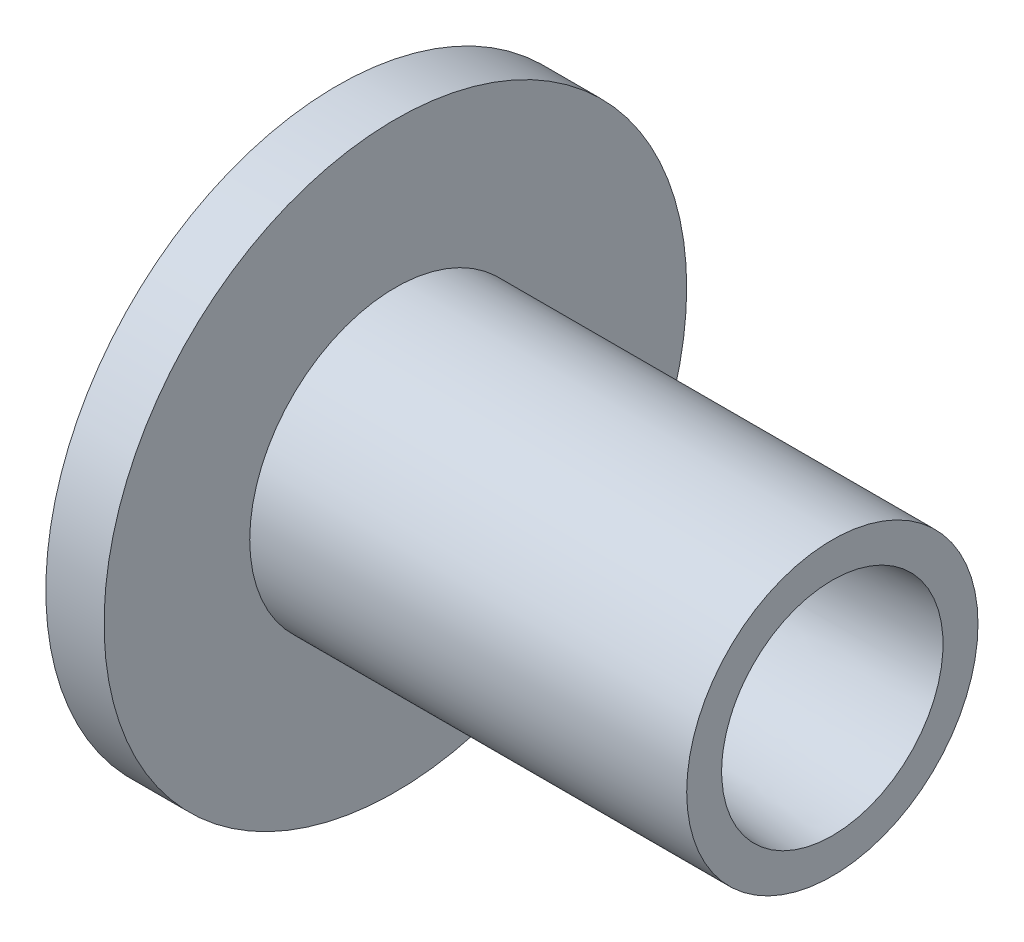
ISO-10303-21;
HEADER;
FILE_DESCRIPTION(('STEP AP214'),'2;1');
FILE_NAME('part.step','',(''),(''),'','','');
FILE_SCHEMA(('AUTOMOTIVE_DESIGN { 1 0 10303 214 1 1 1 1 }'));
ENDSEC;
DATA;
#1=APPLICATION_CONTEXT('core data for automotive mechanical design processes');
#2=APPLICATION_PROTOCOL_DEFINITION('international standard','automotive_design',2000,#1);
#3=PRODUCT_CONTEXT('',#1,'mechanical');
#4=PRODUCT('Part','Part','',(#3));
#5=PRODUCT_RELATED_PRODUCT_CATEGORY('part','',(#4));
#6=PRODUCT_DEFINITION_FORMATION('','',#4);
#7=PRODUCT_DEFINITION_CONTEXT('part definition',#1,'design');
#8=PRODUCT_DEFINITION('design','',#6,#7);
#9=PRODUCT_DEFINITION_SHAPE('','',#8);
#10=(LENGTH_UNIT() NAMED_UNIT(*) SI_UNIT(.MILLI.,.METRE.));
#11=(NAMED_UNIT(*) PLANE_ANGLE_UNIT() SI_UNIT($,.RADIAN.));
#12=(NAMED_UNIT(*) SI_UNIT($,.STERADIAN.) SOLID_ANGLE_UNIT());
#13=UNCERTAINTY_MEASURE_WITH_UNIT(LENGTH_MEASURE(1.E-05),#10,'distance_accuracy_value','');
#14=(GEOMETRIC_REPRESENTATION_CONTEXT(3) GLOBAL_UNCERTAINTY_ASSIGNED_CONTEXT((#13)) GLOBAL_UNIT_ASSIGNED_CONTEXT((#10,
#11,#12)) REPRESENTATION_CONTEXT('',''));
#15=CARTESIAN_POINT('',(0.,0.,0.));
#16=DIRECTION('',(0.,0.,1.));
#17=DIRECTION('',(1.,0.,0.));
#18=AXIS2_PLACEMENT_3D('',#15,#16,#17);
#19=CARTESIAN_POINT('',(2.54,0.,0.));
#20=DIRECTION('',(-1.,0.,0.));
#21=DIRECTION('',(0.,0.,1.));
#22=AXIS2_PLACEMENT_3D('',#19,#20,#21);
#23=CYLINDRICAL_SURFACE('',#22,12.7);
#24=CARTESIAN_POINT('',(2.54,0.,0.));
#25=DIRECTION('',(1.,0.,0.));
#26=DIRECTION('',(0.,0.,-1.));
#27=AXIS2_PLACEMENT_3D('',#24,#25,#26);
#28=CIRCLE('',#27,12.7);
#29=CARTESIAN_POINT('',(2.54,0.,-12.7));
#30=VERTEX_POINT('',#29);
#31=EDGE_CURVE('E47',#30,#30,#28,.T.);
#32=ORIENTED_EDGE('',*,*,#31,.F.);
#33=EDGE_LOOP('',(#32));
#34=FACE_BOUND('',#33,.T.);
#35=CARTESIAN_POINT('',(0.,0.,0.));
#36=DIRECTION('',(1.,0.,0.));
#37=DIRECTION('',(0.,0.,-1.));
#38=AXIS2_PLACEMENT_3D('',#35,#36,#37);
#39=CIRCLE('',#38,12.7);
#40=CARTESIAN_POINT('',(0.,0.,-12.7));
#41=VERTEX_POINT('',#40);
#42=EDGE_CURVE('E42',#41,#41,#39,.T.);
#43=ORIENTED_EDGE('',*,*,#42,.T.);
#44=EDGE_LOOP('',(#43));
#45=FACE_BOUND('',#44,.T.);
#46=ADVANCED_FACE('F39',(#34,#45),#23,.T.);
#47=CARTESIAN_POINT('',(2.54,0.,0.));
#48=DIRECTION('',(1.,0.,0.));
#49=DIRECTION('',(0.,0.,-1.));
#50=AXIS2_PLACEMENT_3D('',#47,#48,#49);
#51=PLANE('',#50);
#52=CARTESIAN_POINT('',(2.54,0.,0.));
#53=DIRECTION('',(1.,0.,0.));
#54=DIRECTION('',(0.,0.,-1.));
#55=AXIS2_PLACEMENT_3D('',#52,#53,#54);
#56=CIRCLE('',#55,6.35);
#57=CARTESIAN_POINT('',(2.54,0.,6.35));
#58=VERTEX_POINT('',#57);
#59=EDGE_CURVE('E11',#58,#58,#56,.T.);
#60=ORIENTED_EDGE('',*,*,#59,.F.);
#61=EDGE_LOOP('',(#60));
#62=FACE_BOUND('',#61,.T.);
#63=ORIENTED_EDGE('',*,*,#31,.T.);
#64=EDGE_LOOP('',(#63));
#65=FACE_BOUND('',#64,.T.);
#66=ADVANCED_FACE('F74',(#62,#65),#51,.T.);
#67=CARTESIAN_POINT('',(0.,0.,0.));
#68=DIRECTION('',(1.,0.,0.));
#69=DIRECTION('',(0.,0.,-1.));
#70=AXIS2_PLACEMENT_3D('',#67,#68,#69);
#71=PLANE('',#70);
#72=CARTESIAN_POINT('',(0.,0.,0.));
#73=DIRECTION('',(-1.,0.,0.));
#74=DIRECTION('',(0.,0.,1.));
#75=AXIS2_PLACEMENT_3D('',#72,#73,#74);
#76=CIRCLE('',#75,3.175);
#77=CARTESIAN_POINT('',(0.,-0.0879149373534168,-3.17378259554591));
#78=VERTEX_POINT('',#77);
#79=EDGE_CURVE('E62',#78,#78,#76,.T.);
#80=ORIENTED_EDGE('',*,*,#79,.F.);
#81=EDGE_LOOP('',(#80));
#82=FACE_BOUND('',#81,.T.);
#83=ORIENTED_EDGE('',*,*,#42,.F.);
#84=EDGE_LOOP('',(#83));
#85=FACE_BOUND('',#84,.T.);
#86=ADVANCED_FACE('F70',(#82,#85),#71,.F.);
#87=CARTESIAN_POINT('',(21.59,0.,0.));
#88=DIRECTION('',(-1.,0.,0.));
#89=DIRECTION('',(0.,0.,1.));
#90=AXIS2_PLACEMENT_3D('',#87,#88,#89);
#91=CYLINDRICAL_SURFACE('',#90,6.35);
#92=CARTESIAN_POINT('',(21.59,0.,0.));
#93=DIRECTION('',(1.,0.,0.));
#94=DIRECTION('',(0.,0.,-1.));
#95=AXIS2_PLACEMENT_3D('',#92,#93,#94);
#96=CIRCLE('',#95,6.35);
#97=CARTESIAN_POINT('',(21.59,0.,6.35));
#98=VERTEX_POINT('',#97);
#99=EDGE_CURVE('E54',#98,#98,#96,.T.);
#100=CARTESIAN_POINT('',(21.59,0.,6.35));
#101=CARTESIAN_POINT('',(21.3915625,0.,6.35));
#102=CARTESIAN_POINT('',(21.193125,0.,6.35));
#103=CARTESIAN_POINT('',(20.79625,0.,6.35));
#104=CARTESIAN_POINT('',(20.5978125,0.,6.35));
#105=CARTESIAN_POINT('',(20.2009375,0.,6.35));
#106=CARTESIAN_POINT('',(20.0025,0.,6.35));
#107=CARTESIAN_POINT('',(19.605625,0.,6.35));
#108=CARTESIAN_POINT('',(19.4071875,0.,6.35));
#109=CARTESIAN_POINT('',(19.0103125,0.,6.35));
#110=CARTESIAN_POINT('',(18.811875,0.,6.35));
#111=CARTESIAN_POINT('',(18.415,0.,6.35));
#112=CARTESIAN_POINT('',(18.2165625,0.,6.35));
#113=CARTESIAN_POINT('',(17.8196875,0.,6.35));
#114=CARTESIAN_POINT('',(17.62125,0.,6.35));
#115=CARTESIAN_POINT('',(17.224375,0.,6.35));
#116=CARTESIAN_POINT('',(17.0259375,0.,6.35));
#117=CARTESIAN_POINT('',(16.6290625,0.,6.35));
#118=CARTESIAN_POINT('',(16.430625,0.,6.35));
#119=CARTESIAN_POINT('',(16.03375,0.,6.35));
#120=CARTESIAN_POINT('',(15.8353125,0.,6.35));
#121=CARTESIAN_POINT('',(15.4384375,0.,6.35));
#122=CARTESIAN_POINT('',(15.24,0.,6.35));
#123=CARTESIAN_POINT('',(14.843125,0.,6.35));
#124=CARTESIAN_POINT('',(14.6446875,0.,6.35));
#125=CARTESIAN_POINT('',(14.2478125,0.,6.35));
#126=CARTESIAN_POINT('',(14.049375,0.,6.35));
#127=CARTESIAN_POINT('',(13.6525,0.,6.35));
#128=CARTESIAN_POINT('',(13.4540625,0.,6.35));
#129=CARTESIAN_POINT('',(13.0571875,0.,6.35));
#130=CARTESIAN_POINT('',(12.85875,0.,6.35));
#131=CARTESIAN_POINT('',(12.461875,0.,6.35));
#132=CARTESIAN_POINT('',(12.2634375,0.,6.35));
#133=CARTESIAN_POINT('',(11.8665625,0.,6.35));
#134=CARTESIAN_POINT('',(11.668125,0.,6.35));
#135=CARTESIAN_POINT('',(11.27125,0.,6.35));
#136=CARTESIAN_POINT('',(11.0728125,0.,6.35));
#137=CARTESIAN_POINT('',(10.6759375,0.,6.35));
#138=CARTESIAN_POINT('',(10.4775,0.,6.35));
#139=CARTESIAN_POINT('',(10.080625,0.,6.35));
#140=CARTESIAN_POINT('',(9.8821875,0.,6.35));
#141=CARTESIAN_POINT('',(9.4853125,0.,6.35));
#142=CARTESIAN_POINT('',(9.286875,0.,6.35));
#143=CARTESIAN_POINT('',(8.89,0.,6.35));
#144=CARTESIAN_POINT('',(8.6915625,0.,6.35));
#145=CARTESIAN_POINT('',(8.2946875,0.,6.35));
#146=CARTESIAN_POINT('',(8.09625,0.,6.35));
#147=CARTESIAN_POINT('',(7.699375,0.,6.35));
#148=CARTESIAN_POINT('',(7.5009375,0.,6.35));
#149=CARTESIAN_POINT('',(7.1040625,0.,6.35));
#150=CARTESIAN_POINT('',(6.905625,0.,6.35));
#151=CARTESIAN_POINT('',(6.50875,0.,6.35));
#152=CARTESIAN_POINT('',(6.3103125,0.,6.35));
#153=CARTESIAN_POINT('',(5.9134375,0.,6.35));
#154=CARTESIAN_POINT('',(5.715,0.,6.35));
#155=CARTESIAN_POINT('',(5.318125,0.,6.35));
#156=CARTESIAN_POINT('',(5.1196875,0.,6.35));
#157=CARTESIAN_POINT('',(4.7228125,0.,6.35));
#158=CARTESIAN_POINT('',(4.524375,0.,6.35));
#159=CARTESIAN_POINT('',(4.1275,0.,6.35));
#160=CARTESIAN_POINT('',(3.9290625,0.,6.35));
#161=CARTESIAN_POINT('',(3.5321875,0.,6.35));
#162=CARTESIAN_POINT('',(3.33375,0.,6.35));
#163=CARTESIAN_POINT('',(2.936875,0.,6.35));
#164=CARTESIAN_POINT('',(2.7384375,0.,6.35));
#165=CARTESIAN_POINT('',(2.54,0.,6.35));
#166=B_SPLINE_CURVE_WITH_KNOTS('',3,(#100,#101,#102,#103,#104,#105,#106,#107,#108,#109,#110,
#111,#112,#113,#114,#115,#116,#117,#118,#119,#120,#121,#122,#123,#124,#125,#126,#127,#128,#129,
#130,#131,#132,#133,#134,#135,#136,#137,#138,#139,#140,#141,#142,#143,#144,#145,#146,#147,#148,
#149,#150,#151,#152,#153,#154,#155,#156,#157,#158,#159,#160,#161,#162,#163,#164,#165),
.UNSPECIFIED.,.F.,.F.,(4,2,2,2,2,2,2,2,2,2,2,2,2,2,2,2,2,2,2,2,2,2,2,2,2,2,2,2,2,2,2,2,4),(0.,
0.5953125,1.190625,1.7859375,2.38125,2.9765625,3.571875,4.1671875,4.7625,5.3578125,5.953125,
6.5484375,7.14375,7.7390625,8.334375,8.9296875,9.525,10.1203125,10.715625,11.3109375,11.90625,
12.5015625,13.096875,13.6921875,14.2875,14.8828125,15.478125,16.0734375,16.66875,17.2640625,
17.859375,18.4546875,19.05),.UNSPECIFIED.);
#167=EDGE_CURVE('BSEAM73',#98,#58,#166,.T.);
#168=ORIENTED_EDGE('',*,*,#99,.F.);
#169=ORIENTED_EDGE('',*,*,#59,.T.);
#170=ORIENTED_EDGE('',*,*,#167,.T.);
#171=ORIENTED_EDGE('',*,*,#167,.F.);
#172=EDGE_LOOP('',(#168,#170,#169,#171));
#173=FACE_BOUND('',#172,.T.);
#174=ADVANCED_FACE('F73',(#173),#91,.T.);
#175=CARTESIAN_POINT('',(21.59,0.,0.));
#176=DIRECTION('',(1.,0.,0.));
#177=DIRECTION('',(0.,0.,-1.));
#178=AXIS2_PLACEMENT_3D('',#175,#176,#177);
#179=PLANE('',#178);
#180=CARTESIAN_POINT('',(21.59,0.,0.));
#181=DIRECTION('',(1.,0.,0.));
#182=DIRECTION('',(0.,0.,-1.));
#183=AXIS2_PLACEMENT_3D('',#180,#181,#182);
#184=CIRCLE('',#183,4.826);
#185=CARTESIAN_POINT('',(21.59,-1.38533104348308,-4.62289237382421));
#186=VERTEX_POINT('',#185);
#187=EDGE_CURVE('E58',#186,#186,#184,.T.);
#188=ORIENTED_EDGE('',*,*,#187,.F.);
#189=EDGE_LOOP('',(#188));
#190=FACE_BOUND('',#189,.T.);
#191=ORIENTED_EDGE('',*,*,#99,.T.);
#192=EDGE_LOOP('',(#191));
#193=FACE_BOUND('',#192,.T.);
#194=ADVANCED_FACE('F93',(#190,#193),#179,.T.);
#195=CARTESIAN_POINT('',(0.,-0.0879149373534168,-3.17378259554591));
#196=CARTESIAN_POINT('',(21.59,-1.38533104348308,-4.62289237382421));
#197=CARTESIAN_POINT('',(0.,6.25965025373841,-3.34961247025275));
#198=CARTESIAN_POINT('',(21.59,7.86045370416534,-7.39355446079038));
#199=CARTESIAN_POINT('',(0.,6.43548012844524,2.99795272083908));
#200=CARTESIAN_POINT('',(21.59,10.6311157911315,1.85223028685805));
#201=CARTESIAN_POINT('',(0.,0.0879149373534172,3.17378259554591));
#202=CARTESIAN_POINT('',(21.59,1.38533104348308,4.62289237382421));
#203=CARTESIAN_POINT('',(0.,-6.2596502537384,3.34961247025275));
#204=CARTESIAN_POINT('',(21.59,-7.86045370416534,7.39355446079038));
#205=CARTESIAN_POINT('',(0.,-6.43548012844524,-2.99795272083908));
#206=CARTESIAN_POINT('',(21.59,-10.6311157911315,-1.85223028685804));
#207=CARTESIAN_POINT('',(0.,-0.0879149373534168,-3.17378259554591));
#208=CARTESIAN_POINT('',(21.59,-1.38533104348308,-4.62289237382421));
#209=(BOUNDED_SURFACE() B_SPLINE_SURFACE(3,1,((#195,#196),(#197,#198),(#199,#200),(#201,#202),
(#203,#204),(#205,#206),(#207,#208)),.UNSPECIFIED.,.T.,.F.,.F.) B_SPLINE_SURFACE_WITH_KNOTS((4,
3,4),(2,2),(0.,0.5,1.),(0.,1.),
.UNSPECIFIED.) GEOMETRIC_REPRESENTATION_ITEM() RATIONAL_B_SPLINE_SURFACE(((1.,1.),
(0.333333333333333,0.333333333333333),(0.333333333333333,0.333333333333333),(1.,1.),
(0.333333333333334,0.333333333333333),(0.333333333333334,0.333333333333333),(1.,1.))) REPRESENTATION_ITEM('') SURFACE());
#210=CARTESIAN_POINT('',(0.,-0.0879149373534168,-3.17378259554591));
#211=CARTESIAN_POINT('',(0.224895833333333,-0.101429688458934,-3.18887748906964));
#212=CARTESIAN_POINT('',(0.449791666666667,-0.114944439564452,-3.20397238259338));
#213=CARTESIAN_POINT('',(0.899583333333334,-0.141973941775486,-3.23416216964084));
#214=CARTESIAN_POINT('',(1.12447916666667,-0.155488692881004,-3.24925706316457));
#215=CARTESIAN_POINT('',(1.57427083333333,-0.182518195092038,-3.27944685021204));
#216=CARTESIAN_POINT('',(1.79916666666667,-0.196032946197556,-3.29454174373577));
#217=CARTESIAN_POINT('',(2.24895833333333,-0.223062448408591,-3.32473153078323));
#218=CARTESIAN_POINT('',(2.47385416666667,-0.236577199514108,-3.33982642430697));
#219=CARTESIAN_POINT('',(2.92364583333333,-0.263606701725143,-3.37001621135443));
#220=CARTESIAN_POINT('',(3.14854166666667,-0.27712145283066,-3.38511110487816));
#221=CARTESIAN_POINT('',(3.59833333333333,-0.304150955041695,-3.41530089192563));
#222=CARTESIAN_POINT('',(3.82322916666667,-0.317665706147212,-3.43039578544936));
#223=CARTESIAN_POINT('',(4.27302083333333,-0.344695208358247,-3.46058557249683));
#224=CARTESIAN_POINT('',(4.49791666666667,-0.358209959463764,-3.47568046602056));
#225=CARTESIAN_POINT('',(4.94770833333333,-0.385239461674799,-3.50587025306802));
#226=CARTESIAN_POINT('',(5.17260416666667,-0.398754212780316,-3.52096514659175));
#227=CARTESIAN_POINT('',(5.62239583333333,-0.425783714991351,-3.55115493363922));
#228=CARTESIAN_POINT('',(5.84729166666667,-0.439298466096869,-3.56624982716295));
#229=CARTESIAN_POINT('',(6.29708333333333,-0.466327968307903,-3.59643961421042));
#230=CARTESIAN_POINT('',(6.52197916666667,-0.479842719413421,-3.61153450773415));
#231=CARTESIAN_POINT('',(6.97177083333333,-0.506872221624455,-3.64172429478161));
#232=CARTESIAN_POINT('',(7.19666666666667,-0.520386972729973,-3.65681918830535));
#233=CARTESIAN_POINT('',(7.64645833333333,-0.547416474941007,-3.68700897535281));
#234=CARTESIAN_POINT('',(7.87135416666667,-0.560931226046525,-3.70210386887654));
#235=CARTESIAN_POINT('',(8.32114583333333,-0.58796072825756,-3.73229365592401));
#236=CARTESIAN_POINT('',(8.54604166666667,-0.601475479363077,-3.74738854944774));
#237=CARTESIAN_POINT('',(8.99583333333334,-0.628504981574112,-3.7775783364952));
#238=CARTESIAN_POINT('',(9.22072916666667,-0.642019732679629,-3.79267323001894));
#239=CARTESIAN_POINT('',(9.67052083333333,-0.669049234890664,-3.8228630170664));
#240=CARTESIAN_POINT('',(9.89541666666667,-0.682563985996181,-3.83795791059013));
#241=CARTESIAN_POINT('',(10.3452083333333,-0.709593488207216,-3.8681476976376));
#242=CARTESIAN_POINT('',(10.5701041666667,-0.723108239312733,-3.88324259116133));
#243=CARTESIAN_POINT('',(11.0198958333333,-0.750137741523768,-3.91343237820879));
#244=CARTESIAN_POINT('',(11.2447916666667,-0.763652492629285,-3.92852727173253));
#245=CARTESIAN_POINT('',(11.6945833333333,-0.79068199484032,-3.95871705877999));
#246=CARTESIAN_POINT('',(11.9194791666667,-0.804196745945838,-3.97381195230372));
#247=CARTESIAN_POINT('',(12.3692708333333,-0.831226248156872,-4.00400173935119));
#248=CARTESIAN_POINT('',(12.5941666666667,-0.84474099926239,-4.01909663287492));
#249=CARTESIAN_POINT('',(13.0439583333333,-0.871770501473424,-4.04928641992239));
#250=CARTESIAN_POINT('',(13.2688541666667,-0.885285252578942,-4.06438131344612));
#251=CARTESIAN_POINT('',(13.7186458333333,-0.912314754789976,-4.09457110049358));
#252=CARTESIAN_POINT('',(13.9435416666667,-0.925829505895494,-4.10966599401732));
#253=CARTESIAN_POINT('',(14.3933333333333,-0.952859008106529,-4.13985578106478));
#254=CARTESIAN_POINT('',(14.6182291666667,-0.966373759212046,-4.15495067458851));
#255=CARTESIAN_POINT('',(15.0680208333333,-0.993403261423081,-4.18514046163598));
#256=CARTESIAN_POINT('',(15.2929166666667,-1.0069180125286,-4.20023535515971));
#257=CARTESIAN_POINT('',(15.7427083333333,-1.03394751473963,-4.23042514220717));
#258=CARTESIAN_POINT('',(15.9676041666667,-1.04746226584515,-4.24552003573091));
#259=CARTESIAN_POINT('',(16.4173958333333,-1.07449176805618,-4.27570982277837));
#260=CARTESIAN_POINT('',(16.6422916666667,-1.0880065191617,-4.2908047163021));
#261=CARTESIAN_POINT('',(17.0920833333333,-1.11503602137274,-4.32099450334957));
#262=CARTESIAN_POINT('',(17.3169791666667,-1.12855077247825,-4.3360893968733));
#263=CARTESIAN_POINT('',(17.7667708333333,-1.15558027468929,-4.36627918392076));
#264=CARTESIAN_POINT('',(17.9916666666667,-1.16909502579481,-4.3813740774445));
#265=CARTESIAN_POINT('',(18.4414583333333,-1.19612452800584,-4.41156386449196));
#266=CARTESIAN_POINT('',(18.6663541666667,-1.20963927911136,-4.42665875801569));
#267=CARTESIAN_POINT('',(19.1161458333333,-1.23666878132239,-4.45684854506316));
#268=CARTESIAN_POINT('',(19.3410416666667,-1.25018353242791,-4.47194343858689));
#269=CARTESIAN_POINT('',(19.7908333333333,-1.27721303463895,-4.50213322563436));
#270=CARTESIAN_POINT('',(20.0157291666667,-1.29072778574446,-4.51722811915809));
#271=CARTESIAN_POINT('',(20.4655208333333,-1.3177572879555,-4.54741790620555));
#272=CARTESIAN_POINT('',(20.6904166666667,-1.33127203906102,-4.56251279972928));
#273=CARTESIAN_POINT('',(21.1402083333333,-1.35830154127205,-4.59270258677675));
#274=CARTESIAN_POINT('',(21.3651041666667,-1.37181629237757,-4.60779748030048));
#275=CARTESIAN_POINT('',(21.59,-1.38533104348308,-4.62289237382421));
#276=B_SPLINE_CURVE_WITH_KNOTS('',3,(#210,#211,#212,#213,#214,#215,#216,#217,#218,#219,#220,
#221,#222,#223,#224,#225,#226,#227,#228,#229,#230,#231,#232,#233,#234,#235,#236,#237,#238,#239,
#240,#241,#242,#243,#244,#245,#246,#247,#248,#249,#250,#251,#252,#253,#254,#255,#256,#257,#258,
#259,#260,#261,#262,#263,#264,#265,#266,#267,#268,#269,#270,#271,#272,#273,#274,#275),
.UNSPECIFIED.,.F.,.F.,(4,2,2,2,2,2,2,2,2,2,2,2,2,2,2,2,2,2,2,2,2,2,2,2,2,2,2,2,2,2,2,2,4),(0.,
0.677419929901448,1.3548398598029,2.03225978970434,2.70967971960579,3.38709964950724,
4.06451957940869,4.74193950931013,5.41935943921158,6.09677936911303,6.77419929901448,
7.45161922891593,8.12903915881737,8.80645908871882,9.48387901862027,10.1612989485217,
10.8387188784232,11.5161388083246,12.1935587382261,12.8709786681275,13.548398598029,
14.2258185279304,14.9032384578319,15.5806583877333,16.2580783176347,16.9354982475362,
17.6129181774376,18.2903381073391,18.9677580372405,19.645177967142,20.3225978970434,
21.0000178269449,21.6774377568463),.UNSPECIFIED.);
#277=EDGE_CURVE('BSEAM67',#78,#186,#276,.T.);
#278=ORIENTED_EDGE('',*,*,#79,.T.);
#279=ORIENTED_EDGE('',*,*,#187,.T.);
#280=ORIENTED_EDGE('',*,*,#277,.T.);
#281=ORIENTED_EDGE('',*,*,#277,.F.);
#282=EDGE_LOOP('',(#278,#280,#279,#281));
#283=FACE_BOUND('',#282,.T.);
#284=ADVANCED_FACE('F67',(#283),#209,.F.);
#285=CLOSED_SHELL('',(#46,#66,#86,#174,#194,#284));
#286=MANIFOLD_SOLID_BREP('B2',#285);
#287=ADVANCED_BREP_SHAPE_REPRESENTATION('',(#18,#286),#14);
#288=SHAPE_DEFINITION_REPRESENTATION(#9,#287);
ENDSEC;
END-ISO-10303-21;
